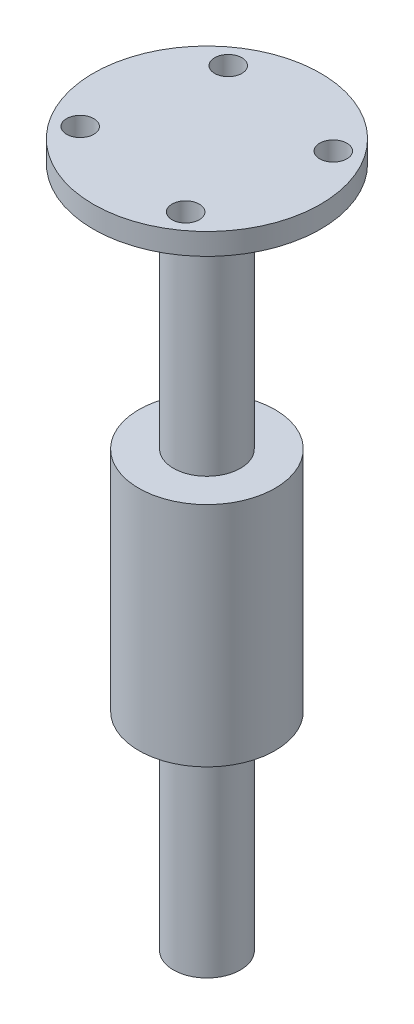
ISO-10303-21;
HEADER;
FILE_DESCRIPTION(('STEP AP214'),'2;1');
FILE_NAME('part.step','',(''),(''),'','','');
FILE_SCHEMA(('AUTOMOTIVE_DESIGN { 1 0 10303 214 1 1 1 1 }'));
ENDSEC;
DATA;
#1=APPLICATION_CONTEXT('core data for automotive mechanical design processes');
#2=APPLICATION_PROTOCOL_DEFINITION('international standard','automotive_design',2000,#1);
#3=PRODUCT_CONTEXT('',#1,'mechanical');
#4=PRODUCT('Part','Part','',(#3));
#5=PRODUCT_RELATED_PRODUCT_CATEGORY('part','',(#4));
#6=PRODUCT_DEFINITION_FORMATION('','',#4);
#7=PRODUCT_DEFINITION_CONTEXT('part definition',#1,'design');
#8=PRODUCT_DEFINITION('design','',#6,#7);
#9=PRODUCT_DEFINITION_SHAPE('','',#8);
#10=(LENGTH_UNIT() NAMED_UNIT(*) SI_UNIT(.MILLI.,.METRE.));
#11=(NAMED_UNIT(*) PLANE_ANGLE_UNIT() SI_UNIT($,.RADIAN.));
#12=(NAMED_UNIT(*) SI_UNIT($,.STERADIAN.) SOLID_ANGLE_UNIT());
#13=UNCERTAINTY_MEASURE_WITH_UNIT(LENGTH_MEASURE(1.E-05),#10,'distance_accuracy_value','');
#14=(GEOMETRIC_REPRESENTATION_CONTEXT(3) GLOBAL_UNCERTAINTY_ASSIGNED_CONTEXT((#13)) GLOBAL_UNIT_ASSIGNED_CONTEXT((#10,
#11,#12)) REPRESENTATION_CONTEXT('',''));
#15=CARTESIAN_POINT('',(0.,0.,0.));
#16=DIRECTION('',(0.,0.,1.));
#17=DIRECTION('',(1.,0.,0.));
#18=AXIS2_PLACEMENT_3D('',#15,#16,#17);
#19=CARTESIAN_POINT('',(0.,60.,0.));
#20=DIRECTION('',(0.,-1.,0.));
#21=DIRECTION('',(0.,0.,-1.));
#22=AXIS2_PLACEMENT_3D('',#19,#20,#21);
#23=CYLINDRICAL_SURFACE('',#22,2.95);
#24=CARTESIAN_POINT('',(0.,60.,0.));
#25=DIRECTION('',(0.,1.,0.));
#26=DIRECTION('',(0.,0.,1.));
#27=AXIS2_PLACEMENT_3D('',#24,#25,#26);
#28=CIRCLE('',#27,2.95);
#29=CARTESIAN_POINT('',(0.,60.,2.95));
#30=VERTEX_POINT('',#29);
#31=EDGE_CURVE('E50',#30,#30,#28,.T.);
#32=ORIENTED_EDGE('',*,*,#31,.F.);
#33=EDGE_LOOP('',(#32));
#34=FACE_BOUND('',#33,.T.);
#35=CARTESIAN_POINT('',(0.,38.25,0.));
#36=DIRECTION('',(0.,-1.,0.));
#37=DIRECTION('',(0.,0.,-1.));
#38=AXIS2_PLACEMENT_3D('',#35,#36,#37);
#39=CIRCLE('',#38,2.95);
#40=CARTESIAN_POINT('',(0.,38.25,-2.95));
#41=VERTEX_POINT('',#40);
#42=EDGE_CURVE('E11',#41,#41,#39,.T.);
#43=ORIENTED_EDGE('',*,*,#42,.F.);
#44=EDGE_LOOP('',(#43));
#45=FACE_BOUND('',#44,.T.);
#46=ADVANCED_FACE('F42',(#34,#45),#23,.T.);
#47=CARTESIAN_POINT('',(0.,63.,0.));
#48=DIRECTION('',(0.,-1.,0.));
#49=DIRECTION('',(0.,0.,-1.));
#50=AXIS2_PLACEMENT_3D('',#47,#48,#49);
#51=CYLINDRICAL_SURFACE('',#50,10.);
#52=CARTESIAN_POINT('',(0.,60.,0.));
#53=DIRECTION('',(0.,1.,0.));
#54=DIRECTION('',(0.,0.,1.));
#55=AXIS2_PLACEMENT_3D('',#52,#53,#54);
#56=CIRCLE('',#55,10.);
#57=CARTESIAN_POINT('',(0.,60.,10.));
#58=VERTEX_POINT('',#57);
#59=EDGE_CURVE('E60',#58,#58,#56,.T.);
#60=ORIENTED_EDGE('',*,*,#59,.T.);
#61=EDGE_LOOP('',(#60));
#62=FACE_BOUND('',#61,.T.);
#63=CARTESIAN_POINT('',(0.,61.9,0.));
#64=DIRECTION('',(0.,1.,0.));
#65=DIRECTION('',(0.,0.,1.));
#66=AXIS2_PLACEMENT_3D('',#63,#64,#65);
#67=CIRCLE('',#66,10.);
#68=CARTESIAN_POINT('',(0.,61.9,10.));
#69=VERTEX_POINT('',#68);
#70=EDGE_CURVE('E70',#69,#69,#67,.T.);
#71=ORIENTED_EDGE('',*,*,#70,.F.);
#72=EDGE_LOOP('',(#71));
#73=FACE_BOUND('',#72,.T.);
#74=ADVANCED_FACE('F116',(#62,#73),#51,.T.);
#75=CARTESIAN_POINT('',(6.49577118195722,53.,-4.62686821046697));
#76=DIRECTION('',(0.,1.,0.));
#77=DIRECTION('',(0.,0.,1.));
#78=AXIS2_PLACEMENT_3D('',#75,#76,#77);
#79=CYLINDRICAL_SURFACE('',#78,1.2);
#80=CARTESIAN_POINT('',(6.49577118195722,60.,-4.62686821046697));
#81=DIRECTION('',(0.,1.,0.));
#82=DIRECTION('',(0.,0.,1.));
#83=AXIS2_PLACEMENT_3D('',#80,#81,#82);
#84=CIRCLE('',#83,1.2);
#85=CARTESIAN_POINT('',(6.49577118195722,60.,-3.42686821046697));
#86=VERTEX_POINT('',#85);
#87=EDGE_CURVE('E67',#86,#86,#84,.T.);
#88=ORIENTED_EDGE('',*,*,#87,.F.);
#89=EDGE_LOOP('',(#88));
#90=FACE_BOUND('',#89,.T.);
#91=CARTESIAN_POINT('',(6.49577118195722,61.9,-4.62686821046697));
#92=DIRECTION('',(0.,1.,0.));
#93=DIRECTION('',(0.,0.,1.));
#94=AXIS2_PLACEMENT_3D('',#91,#92,#93);
#95=CIRCLE('',#94,1.2);
#96=CARTESIAN_POINT('',(6.49577118195722,61.9,-3.42686821046697));
#97=VERTEX_POINT('',#96);
#98=EDGE_CURVE('E83',#97,#97,#95,.T.);
#99=ORIENTED_EDGE('',*,*,#98,.T.);
#100=EDGE_LOOP('',(#99));
#101=FACE_BOUND('',#100,.T.);
#102=ADVANCED_FACE('F123',(#90,#101),#79,.F.);
#103=CARTESIAN_POINT('',(4.64128756830011,53.,6.51601486403636));
#104=DIRECTION('',(0.,1.,0.));
#105=DIRECTION('',(0.,0.,1.));
#106=AXIS2_PLACEMENT_3D('',#103,#104,#105);
#107=CYLINDRICAL_SURFACE('',#106,1.2);
#108=CARTESIAN_POINT('',(4.64128756830011,60.,6.51601486403636));
#109=DIRECTION('',(0.,1.,0.));
#110=DIRECTION('',(0.,0.,1.));
#111=AXIS2_PLACEMENT_3D('',#108,#109,#110);
#112=CIRCLE('',#111,1.2);
#113=CARTESIAN_POINT('',(4.64128756830011,60.,7.71601486403636));
#114=VERTEX_POINT('',#113);
#115=EDGE_CURVE('E64',#114,#114,#112,.T.);
#116=ORIENTED_EDGE('',*,*,#115,.F.);
#117=EDGE_LOOP('',(#116));
#118=FACE_BOUND('',#117,.T.);
#119=CARTESIAN_POINT('',(4.64128756830011,61.9,6.51601486403636));
#120=DIRECTION('',(0.,1.,0.));
#121=DIRECTION('',(0.,0.,1.));
#122=AXIS2_PLACEMENT_3D('',#119,#120,#121);
#123=CIRCLE('',#122,1.2);
#124=CARTESIAN_POINT('',(4.64128756830011,61.9,7.71601486403636));
#125=VERTEX_POINT('',#124);
#126=EDGE_CURVE('E77',#125,#125,#123,.T.);
#127=ORIENTED_EDGE('',*,*,#126,.T.);
#128=EDGE_LOOP('',(#127));
#129=FACE_BOUND('',#128,.T.);
#130=ADVANCED_FACE('F145',(#118,#129),#107,.F.);
#131=CARTESIAN_POINT('',(-6.51601486403636,53.,4.64128756830011));
#132=DIRECTION('',(0.,1.,0.));
#133=DIRECTION('',(0.,0.,1.));
#134=AXIS2_PLACEMENT_3D('',#131,#132,#133);
#135=CYLINDRICAL_SURFACE('',#134,1.2);
#136=CARTESIAN_POINT('',(-6.51601486403636,60.,4.64128756830011));
#137=DIRECTION('',(0.,1.,0.));
#138=DIRECTION('',(0.,0.,1.));
#139=AXIS2_PLACEMENT_3D('',#136,#137,#138);
#140=CIRCLE('',#139,1.2);
#141=CARTESIAN_POINT('',(-6.51601486403636,60.,5.84128756830011));
#142=VERTEX_POINT('',#141);
#143=EDGE_CURVE('E61',#142,#142,#140,.T.);
#144=ORIENTED_EDGE('',*,*,#143,.F.);
#145=EDGE_LOOP('',(#144));
#146=FACE_BOUND('',#145,.T.);
#147=CARTESIAN_POINT('',(-6.51601486403636,61.9,4.64128756830011));
#148=DIRECTION('',(0.,1.,0.));
#149=DIRECTION('',(0.,0.,1.));
#150=AXIS2_PLACEMENT_3D('',#147,#148,#149);
#151=CIRCLE('',#150,1.2);
#152=CARTESIAN_POINT('',(-6.51601486403636,61.9,5.84128756830011));
#153=VERTEX_POINT('',#152);
#154=EDGE_CURVE('E80',#153,#153,#151,.T.);
#155=ORIENTED_EDGE('',*,*,#154,.T.);
#156=EDGE_LOOP('',(#155));
#157=FACE_BOUND('',#156,.T.);
#158=ADVANCED_FACE('F149',(#146,#157),#135,.F.);
#159=CARTESIAN_POINT('',(-4.64128756830011,53.,-6.51601486403637));
#160=DIRECTION('',(0.,1.,0.));
#161=DIRECTION('',(0.,0.,1.));
#162=AXIS2_PLACEMENT_3D('',#159,#160,#161);
#163=CYLINDRICAL_SURFACE('',#162,1.2);
#164=CARTESIAN_POINT('',(-4.64128756830011,60.,-6.51601486403637));
#165=DIRECTION('',(0.,1.,0.));
#166=DIRECTION('',(0.,0.,1.));
#167=AXIS2_PLACEMENT_3D('',#164,#165,#166);
#168=CIRCLE('',#167,1.2);
#169=CARTESIAN_POINT('',(-4.64128756830011,60.,-5.31601486403637));
#170=VERTEX_POINT('',#169);
#171=EDGE_CURVE('E57',#170,#170,#168,.T.);
#172=ORIENTED_EDGE('',*,*,#171,.F.);
#173=EDGE_LOOP('',(#172));
#174=FACE_BOUND('',#173,.T.);
#175=CARTESIAN_POINT('',(-4.64128756830011,61.9,-6.51601486403637));
#176=DIRECTION('',(0.,1.,0.));
#177=DIRECTION('',(0.,0.,1.));
#178=AXIS2_PLACEMENT_3D('',#175,#176,#177);
#179=CIRCLE('',#178,1.2);
#180=CARTESIAN_POINT('',(-4.64128756830011,61.9,-5.31601486403637));
#181=VERTEX_POINT('',#180);
#182=EDGE_CURVE('E86',#181,#181,#179,.T.);
#183=ORIENTED_EDGE('',*,*,#182,.T.);
#184=EDGE_LOOP('',(#183));
#185=FACE_BOUND('',#184,.T.);
#186=ADVANCED_FACE('F141',(#174,#185),#163,.F.);
#187=CARTESIAN_POINT('',(0.,60.,0.));
#188=DIRECTION('',(0.,1.,0.));
#189=DIRECTION('',(0.,0.,1.));
#190=AXIS2_PLACEMENT_3D('',#187,#188,#189);
#191=PLANE('',#190);
#192=ORIENTED_EDGE('',*,*,#171,.T.);
#193=EDGE_LOOP('',(#192));
#194=FACE_BOUND('',#193,.T.);
#195=ORIENTED_EDGE('',*,*,#143,.T.);
#196=EDGE_LOOP('',(#195));
#197=FACE_BOUND('',#196,.T.);
#198=ORIENTED_EDGE('',*,*,#115,.T.);
#199=EDGE_LOOP('',(#198));
#200=FACE_BOUND('',#199,.T.);
#201=ORIENTED_EDGE('',*,*,#87,.T.);
#202=EDGE_LOOP('',(#201));
#203=FACE_BOUND('',#202,.T.);
#204=ORIENTED_EDGE('',*,*,#31,.T.);
#205=EDGE_LOOP('',(#204));
#206=FACE_BOUND('',#205,.T.);
#207=ORIENTED_EDGE('',*,*,#59,.F.);
#208=EDGE_LOOP('',(#207));
#209=FACE_BOUND('',#208,.T.);
#210=ADVANCED_FACE('F139',(#194,#197,#200,#203,#206,#209),#191,.F.);
#211=CARTESIAN_POINT('',(0.,61.9,0.));
#212=DIRECTION('',(0.,1.,0.));
#213=DIRECTION('',(0.,0.,1.));
#214=AXIS2_PLACEMENT_3D('',#211,#212,#213);
#215=PLANE('',#214);
#216=ORIENTED_EDGE('',*,*,#182,.F.);
#217=EDGE_LOOP('',(#216));
#218=FACE_BOUND('',#217,.T.);
#219=ORIENTED_EDGE('',*,*,#98,.F.);
#220=EDGE_LOOP('',(#219));
#221=FACE_BOUND('',#220,.T.);
#222=ORIENTED_EDGE('',*,*,#154,.F.);
#223=EDGE_LOOP('',(#222));
#224=FACE_BOUND('',#223,.T.);
#225=ORIENTED_EDGE('',*,*,#126,.F.);
#226=EDGE_LOOP('',(#225));
#227=FACE_BOUND('',#226,.T.);
#228=ORIENTED_EDGE('',*,*,#70,.T.);
#229=EDGE_LOOP('',(#228));
#230=FACE_BOUND('',#229,.T.);
#231=ADVANCED_FACE('F112',(#218,#221,#224,#227,#230),#215,.T.);
#232=CARTESIAN_POINT('',(0.,18.25,0.));
#233=DIRECTION('',(0.,1.,0.));
#234=DIRECTION('',(0.,0.,1.));
#235=AXIS2_PLACEMENT_3D('',#232,#233,#234);
#236=CYLINDRICAL_SURFACE('',#235,6.);
#237=CARTESIAN_POINT('',(0.,18.25,0.));
#238=DIRECTION('',(0.,-1.,0.));
#239=DIRECTION('',(0.,0.,-1.));
#240=AXIS2_PLACEMENT_3D('',#237,#238,#239);
#241=CIRCLE('',#240,6.);
#242=CARTESIAN_POINT('',(0.,18.25,-6.));
#243=VERTEX_POINT('',#242);
#244=EDGE_CURVE('E92',#243,#243,#241,.T.);
#245=ORIENTED_EDGE('',*,*,#244,.F.);
#246=EDGE_LOOP('',(#245));
#247=FACE_BOUND('',#246,.T.);
#248=CARTESIAN_POINT('',(0.,38.25,0.));
#249=DIRECTION('',(0.,-1.,0.));
#250=DIRECTION('',(0.,0.,-1.));
#251=AXIS2_PLACEMENT_3D('',#248,#249,#250);
#252=CIRCLE('',#251,6.);
#253=CARTESIAN_POINT('',(0.,38.25,-6.));
#254=VERTEX_POINT('',#253);
#255=EDGE_CURVE('E89',#254,#254,#252,.T.);
#256=ORIENTED_EDGE('',*,*,#255,.T.);
#257=EDGE_LOOP('',(#256));
#258=FACE_BOUND('',#257,.T.);
#259=ADVANCED_FACE('F104',(#247,#258),#236,.T.);
#260=CARTESIAN_POINT('',(0.,18.25,0.));
#261=DIRECTION('',(0.,-1.,0.));
#262=DIRECTION('',(0.,0.,-1.));
#263=AXIS2_PLACEMENT_3D('',#260,#261,#262);
#264=PLANE('',#263);
#265=CARTESIAN_POINT('',(0.,18.25,0.));
#266=DIRECTION('',(0.,-1.,0.));
#267=DIRECTION('',(0.,0.,-1.));
#268=AXIS2_PLACEMENT_3D('',#265,#266,#267);
#269=CIRCLE('',#268,2.95);
#270=CARTESIAN_POINT('',(0.,18.25,-2.95));
#271=VERTEX_POINT('',#270);
#272=EDGE_CURVE('E46',#271,#271,#269,.T.);
#273=ORIENTED_EDGE('',*,*,#272,.F.);
#274=EDGE_LOOP('',(#273));
#275=FACE_BOUND('',#274,.T.);
#276=ORIENTED_EDGE('',*,*,#244,.T.);
#277=EDGE_LOOP('',(#276));
#278=FACE_BOUND('',#277,.T.);
#279=ADVANCED_FACE('F101',(#275,#278),#264,.T.);
#280=CARTESIAN_POINT('',(0.,38.25,0.));
#281=DIRECTION('',(0.,-1.,0.));
#282=DIRECTION('',(0.,0.,-1.));
#283=AXIS2_PLACEMENT_3D('',#280,#281,#282);
#284=PLANE('',#283);
#285=ORIENTED_EDGE('',*,*,#42,.T.);
#286=EDGE_LOOP('',(#285));
#287=FACE_BOUND('',#286,.T.);
#288=ORIENTED_EDGE('',*,*,#255,.F.);
#289=EDGE_LOOP('',(#288));
#290=FACE_BOUND('',#289,.T.);
#291=ADVANCED_FACE('F103',(#287,#290),#284,.F.);
#292=CARTESIAN_POINT('',(0.,0.,0.));
#293=DIRECTION('',(0.,1.,0.));
#294=DIRECTION('',(0.,0.,1.));
#295=AXIS2_PLACEMENT_3D('',#292,#293,#294);
#296=PLANE('',#295);
#297=CARTESIAN_POINT('',(0.,0.,0.));
#298=DIRECTION('',(0.,1.,0.));
#299=DIRECTION('',(0.,0.,1.));
#300=AXIS2_PLACEMENT_3D('',#297,#298,#299);
#301=CIRCLE('',#300,2.95);
#302=CARTESIAN_POINT('',(0.,0.,2.95));
#303=VERTEX_POINT('',#302);
#304=EDGE_CURVE('E54',#303,#303,#301,.T.);
#305=ORIENTED_EDGE('',*,*,#304,.F.);
#306=EDGE_LOOP('',(#305));
#307=FACE_BOUND('',#306,.T.);
#308=ADVANCED_FACE('F110',(#307),#296,.F.);
#309=ORIENTED_EDGE('',*,*,#272,.T.);
#310=EDGE_LOOP('',(#309));
#311=FACE_BOUND('',#310,.T.);
#312=ORIENTED_EDGE('',*,*,#304,.T.);
#313=EDGE_LOOP('',(#312));
#314=FACE_BOUND('',#313,.T.);
#315=ADVANCED_FACE('F44',(#311,#314),#23,.T.);
#316=CLOSED_SHELL('',(#46,#74,#102,#130,#158,#186,#210,#231,#259,#279,#291,#308,#315));
#317=MANIFOLD_SOLID_BREP('B2',#316);
#318=ADVANCED_BREP_SHAPE_REPRESENTATION('',(#18,#317),#14);
#319=SHAPE_DEFINITION_REPRESENTATION(#9,#318);
ENDSEC;
END-ISO-10303-21;
